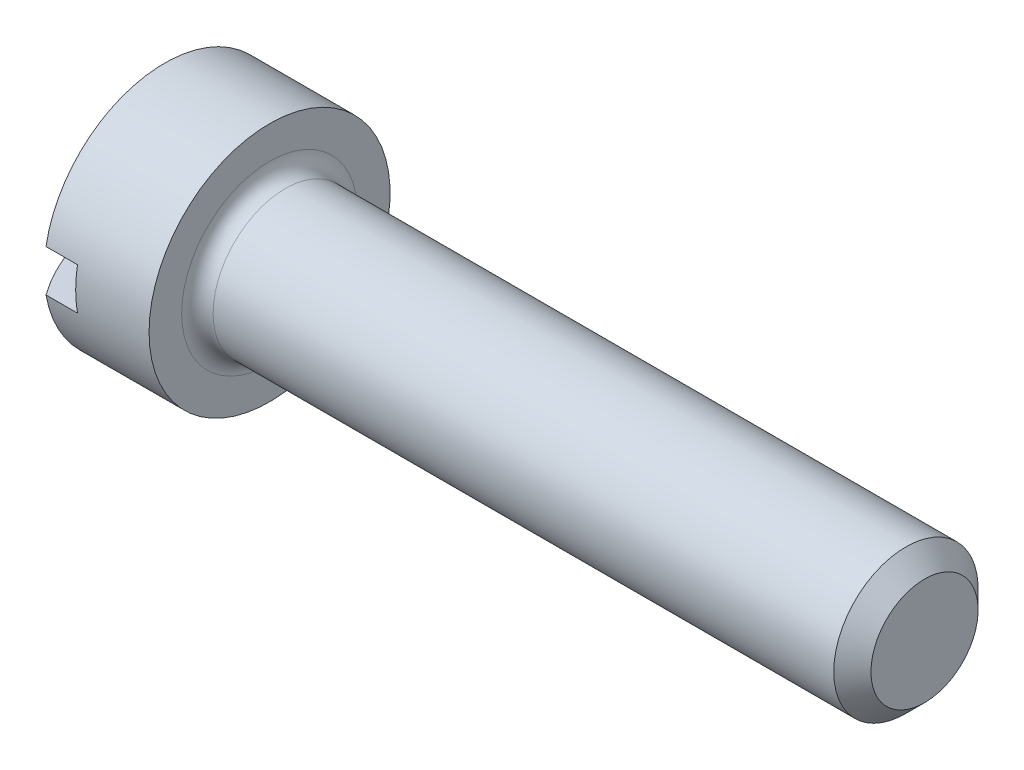
ISO-10303-21;
HEADER;
FILE_DESCRIPTION(('STEP AP214'),'2;1');
FILE_NAME('part.step','',(''),(''),'','','');
FILE_SCHEMA(('AUTOMOTIVE_DESIGN { 1 0 10303 214 1 1 1 1 }'));
ENDSEC;
DATA;
#1=APPLICATION_CONTEXT('core data for automotive mechanical design processes');
#2=APPLICATION_PROTOCOL_DEFINITION('international standard','automotive_design',2000,#1);
#3=PRODUCT_CONTEXT('',#1,'mechanical');
#4=PRODUCT('Part','Part','',(#3));
#5=PRODUCT_RELATED_PRODUCT_CATEGORY('part','',(#4));
#6=PRODUCT_DEFINITION_FORMATION('','',#4);
#7=PRODUCT_DEFINITION_CONTEXT('part definition',#1,'design');
#8=PRODUCT_DEFINITION('design','',#6,#7);
#9=PRODUCT_DEFINITION_SHAPE('','',#8);
#10=(LENGTH_UNIT() NAMED_UNIT(*) SI_UNIT(.MILLI.,.METRE.));
#11=(NAMED_UNIT(*) PLANE_ANGLE_UNIT() SI_UNIT($,.RADIAN.));
#12=(NAMED_UNIT(*) SI_UNIT($,.STERADIAN.) SOLID_ANGLE_UNIT());
#13=UNCERTAINTY_MEASURE_WITH_UNIT(LENGTH_MEASURE(1.E-05),#10,'distance_accuracy_value','');
#14=(GEOMETRIC_REPRESENTATION_CONTEXT(3) GLOBAL_UNCERTAINTY_ASSIGNED_CONTEXT((#13)) GLOBAL_UNIT_ASSIGNED_CONTEXT((#10,
#11,#12)) REPRESENTATION_CONTEXT('',''));
#15=CARTESIAN_POINT('',(0.,0.,0.));
#16=DIRECTION('',(0.,0.,1.));
#17=DIRECTION('',(1.,0.,0.));
#18=AXIS2_PLACEMENT_3D('',#15,#16,#17);
#19=CARTESIAN_POINT('',(-25.4,0.,0.));
#20=DIRECTION('',(-1.,0.,0.));
#21=DIRECTION('',(0.,0.,1.));
#22=AXIS2_PLACEMENT_3D('',#19,#20,#21);
#23=CYLINDRICAL_SURFACE('',#22,1.1684);
#24=CARTESIAN_POINT('',(1.397,0.,0.));
#25=DIRECTION('',(-1.,0.,0.));
#26=DIRECTION('',(0.,0.,1.));
#27=AXIS2_PLACEMENT_3D('',#24,#25,#26);
#28=CIRCLE('',#27,1.1684);
#29=CARTESIAN_POINT('',(1.397,0.,1.1684));
#30=VERTEX_POINT('',#29);
#31=EDGE_CURVE('E110',#30,#30,#28,.T.);
#32=ORIENTED_EDGE('',*,*,#31,.T.);
#33=EDGE_LOOP('',(#32));
#34=FACE_BOUND('',#33,.T.);
#35=CARTESIAN_POINT('',(0.37999556740408,0.,0.));
#36=DIRECTION('',(-1.,0.,0.));
#37=DIRECTION('',(0.,0.,1.));
#38=AXIS2_PLACEMENT_3D('',#35,#36,#37);
#39=CIRCLE('',#38,1.1684);
#40=CARTESIAN_POINT('',(0.37999556740408,-0.2032,-1.15059476793526));
#41=VERTEX_POINT('',#40);
#42=CARTESIAN_POINT('',(0.37999556740408,-0.2032,1.15059476793526));
#43=VERTEX_POINT('',#42);
#44=EDGE_CURVE('E107',#41,#43,#39,.T.);
#45=ORIENTED_EDGE('',*,*,#44,.F.);
#46=DIRECTION('',(-1.,0.,0.));
#47=VECTOR('',#46,1.);
#48=CARTESIAN_POINT('',(-25.4,-0.2032,-1.15059476793526));
#49=LINE('',#48,#47);
#50=CARTESIAN_POINT('',(0.6858,-0.2032,-1.15059476793526));
#51=VERTEX_POINT('',#50);
#52=EDGE_CURVE('E94',#41,#51,#49,.F.);
#53=ORIENTED_EDGE('',*,*,#52,.T.);
#54=CARTESIAN_POINT('',(0.6858,0.,0.));
#55=DIRECTION('',(-1.,0.,0.));
#56=DIRECTION('',(0.,0.,1.));
#57=AXIS2_PLACEMENT_3D('',#54,#55,#56);
#58=CIRCLE('',#57,1.1684);
#59=CARTESIAN_POINT('',(0.6858,0.2032,-1.15059476793526));
#60=VERTEX_POINT('',#59);
#61=EDGE_CURVE('E82',#51,#60,#58,.F.);
#62=ORIENTED_EDGE('',*,*,#61,.T.);
#63=DIRECTION('',(-1.,0.,0.));
#64=VECTOR('',#63,1.);
#65=CARTESIAN_POINT('',(-25.4,0.2032,-1.15059476793526));
#66=LINE('',#65,#64);
#67=CARTESIAN_POINT('',(0.37999556740408,0.2032,-1.15059476793526));
#68=VERTEX_POINT('',#67);
#69=EDGE_CURVE('E86',#60,#68,#66,.T.);
#70=ORIENTED_EDGE('',*,*,#69,.T.);
#71=CARTESIAN_POINT('',(0.37999556740408,0.2032,1.15059476793526));
#72=VERTEX_POINT('',#71);
#73=EDGE_CURVE('E91',#72,#68,#39,.T.);
#74=ORIENTED_EDGE('',*,*,#73,.F.);
#75=DIRECTION('',(-1.,0.,0.));
#76=VECTOR('',#75,1.);
#77=CARTESIAN_POINT('',(-25.4,0.2032,1.15059476793526));
#78=LINE('',#77,#76);
#79=CARTESIAN_POINT('',(0.6858,0.2032,1.15059476793526));
#80=VERTEX_POINT('',#79);
#81=EDGE_CURVE('E47',#72,#80,#78,.F.);
#82=ORIENTED_EDGE('',*,*,#81,.T.);
#83=CARTESIAN_POINT('',(0.6858,-0.2032,1.15059476793526));
#84=VERTEX_POINT('',#83);
#85=EDGE_CURVE('E75',#80,#84,#58,.F.);
#86=ORIENTED_EDGE('',*,*,#85,.T.);
#87=DIRECTION('',(-1.,0.,0.));
#88=VECTOR('',#87,1.);
#89=CARTESIAN_POINT('',(-25.4,-0.2032,1.15059476793526));
#90=LINE('',#89,#88);
#91=EDGE_CURVE('E92',#84,#43,#90,.T.);
#92=ORIENTED_EDGE('',*,*,#91,.T.);
#93=EDGE_LOOP('',(#45,#53,#62,#70,#74,#82,#86,#92));
#94=FACE_BOUND('',#93,.T.);
#95=ADVANCED_FACE('F32',(#34,#94),#23,.T.);
#96=CARTESIAN_POINT('',(1.98628,0.,0.));
#97=DIRECTION('',(-1.,0.,0.));
#98=DIRECTION('',(0.,1.,0.));
#99=AXIS2_PLACEMENT_3D('',#96,#97,#98);
#100=SPHERICAL_SURFACE('',#99,1.98628);
#101=CARTESIAN_POINT('',(1.98628,-0.2032,0.));
#102=DIRECTION('',(0.,1.,0.));
#103=DIRECTION('',(0.,0.,1.));
#104=AXIS2_PLACEMENT_3D('',#101,#102,#103);
#105=CIRCLE('',#104,1.97585880021827);
#106=EDGE_CURVE('E55',#41,#43,#105,.T.);
#107=ORIENTED_EDGE('',*,*,#106,.F.);
#108=ORIENTED_EDGE('',*,*,#44,.T.);
#109=EDGE_LOOP('',(#107,#108));
#110=FACE_BOUND('',#109,.T.);
#111=ADVANCED_FACE('F120',(#110),#100,.T.);
#112=CARTESIAN_POINT('',(1.98628,0.2032,0.));
#113=DIRECTION('',(0.,-1.,0.));
#114=DIRECTION('',(0.,0.,-1.));
#115=AXIS2_PLACEMENT_3D('',#112,#113,#114);
#116=CIRCLE('',#115,1.97585880021827);
#117=EDGE_CURVE('E113',#72,#68,#116,.T.);
#118=ORIENTED_EDGE('',*,*,#117,.F.);
#119=ORIENTED_EDGE('',*,*,#73,.T.);
#120=EDGE_LOOP('',(#118,#119));
#121=FACE_BOUND('',#120,.T.);
#122=ADVANCED_FACE('F122',(#121),#100,.T.);
#123=CARTESIAN_POINT('',(-25.4,0.,0.));
#124=DIRECTION('',(-1.,0.,0.));
#125=DIRECTION('',(0.,0.,1.));
#126=AXIS2_PLACEMENT_3D('',#123,#124,#125);
#127=CYLINDRICAL_SURFACE('',#126,0.69977);
#128=CARTESIAN_POINT('',(1.5494,0.,0.));
#129=DIRECTION('',(-1.,0.,0.));
#130=DIRECTION('',(0.,0.,1.));
#131=AXIS2_PLACEMENT_3D('',#128,#129,#130);
#132=CIRCLE('',#131,0.69977);
#133=CARTESIAN_POINT('',(1.5494,0.,0.69977));
#134=VERTEX_POINT('',#133);
#135=EDGE_CURVE('E11',#134,#134,#132,.F.);
#136=ORIENTED_EDGE('',*,*,#135,.T.);
#137=EDGE_LOOP('',(#136));
#138=FACE_BOUND('',#137,.T.);
#139=CARTESIAN_POINT('',(7.56666,0.,0.));
#140=DIRECTION('',(-1.,0.,0.));
#141=DIRECTION('',(0.,0.,1.));
#142=AXIS2_PLACEMENT_3D('',#139,#140,#141);
#143=CIRCLE('',#142,0.69977);
#144=CARTESIAN_POINT('',(7.56666,0.,0.69977));
#145=VERTEX_POINT('',#144);
#146=EDGE_CURVE('E101',#145,#145,#143,.T.);
#147=ORIENTED_EDGE('',*,*,#146,.T.);
#148=EDGE_LOOP('',(#147));
#149=FACE_BOUND('',#148,.T.);
#150=ADVANCED_FACE('F128',(#138,#149),#127,.T.);
#151=CARTESIAN_POINT('',(1.397,0.69977,0.));
#152=DIRECTION('',(-1.,0.,0.));
#153=DIRECTION('',(0.,0.,1.));
#154=AXIS2_PLACEMENT_3D('',#151,#152,#153);
#155=PLANE('',#154);
#156=CARTESIAN_POINT('',(1.397,0.,0.));
#157=DIRECTION('',(-1.,0.,0.));
#158=DIRECTION('',(0.,0.,1.));
#159=AXIS2_PLACEMENT_3D('',#156,#157,#158);
#160=CIRCLE('',#159,0.85217);
#161=CARTESIAN_POINT('',(1.397,0.,0.85217));
#162=VERTEX_POINT('',#161);
#163=EDGE_CURVE('E40',#162,#162,#160,.T.);
#164=ORIENTED_EDGE('',*,*,#163,.T.);
#165=EDGE_LOOP('',(#164));
#166=FACE_BOUND('',#165,.T.);
#167=ORIENTED_EDGE('',*,*,#31,.F.);
#168=EDGE_LOOP('',(#167));
#169=FACE_BOUND('',#168,.T.);
#170=ADVANCED_FACE('F136',(#166,#169),#155,.F.);
#171=CARTESIAN_POINT('',(7.747,0.51943,0.));
#172=DIRECTION('',(1.,0.,0.));
#173=DIRECTION('',(0.,0.,-1.));
#174=AXIS2_PLACEMENT_3D('',#171,#172,#173);
#175=PLANE('',#174);
#176=CARTESIAN_POINT('',(7.747,0.,0.));
#177=DIRECTION('',(-1.,0.,0.));
#178=DIRECTION('',(0.,0.,1.));
#179=AXIS2_PLACEMENT_3D('',#176,#177,#178);
#180=CIRCLE('',#179,0.51943);
#181=CARTESIAN_POINT('',(7.747,0.,0.51943));
#182=VERTEX_POINT('',#181);
#183=EDGE_CURVE('E104',#182,#182,#180,.T.);
#184=ORIENTED_EDGE('',*,*,#183,.F.);
#185=EDGE_LOOP('',(#184));
#186=FACE_BOUND('',#185,.T.);
#187=ADVANCED_FACE('F133',(#186),#175,.T.);
#188=CARTESIAN_POINT('',(7.56666,0.,0.));
#189=DIRECTION('',(-1.,0.,0.));
#190=DIRECTION('',(0.,0.,1.));
#191=AXIS2_PLACEMENT_3D('',#188,#189,#190);
#192=CONICAL_SURFACE('',#191,0.69977,0.785398163397446);
#193=ORIENTED_EDGE('',*,*,#183,.T.);
#194=EDGE_LOOP('',(#193));
#195=FACE_BOUND('',#194,.T.);
#196=ORIENTED_EDGE('',*,*,#146,.F.);
#197=EDGE_LOOP('',(#196));
#198=FACE_BOUND('',#197,.T.);
#199=ADVANCED_FACE('F146',(#195,#198),#192,.T.);
#200=CARTESIAN_POINT('',(0.,-0.2032,-1.1684));
#201=DIRECTION('',(0.,1.,0.));
#202=DIRECTION('',(0.,0.,1.));
#203=AXIS2_PLACEMENT_3D('',#200,#201,#202);
#204=PLANE('',#203);
#205=ORIENTED_EDGE('',*,*,#106,.T.);
#206=ORIENTED_EDGE('',*,*,#91,.F.);
#207=DIRECTION('',(0.,0.,1.));
#208=VECTOR('',#207,1.);
#209=CARTESIAN_POINT('',(0.6858,-0.2032,-1.1684));
#210=LINE('',#209,#208);
#211=EDGE_CURVE('E80',#51,#84,#210,.T.);
#212=ORIENTED_EDGE('',*,*,#211,.F.);
#213=ORIENTED_EDGE('',*,*,#52,.F.);
#214=EDGE_LOOP('',(#205,#206,#212,#213));
#215=FACE_BOUND('',#214,.T.);
#216=ADVANCED_FACE('F118',(#215),#204,.T.);
#217=CARTESIAN_POINT('',(0.,0.2032,1.1684));
#218=DIRECTION('',(0.,-1.,0.));
#219=DIRECTION('',(0.,0.,-1.));
#220=AXIS2_PLACEMENT_3D('',#217,#218,#219);
#221=PLANE('',#220);
#222=ORIENTED_EDGE('',*,*,#117,.T.);
#223=ORIENTED_EDGE('',*,*,#69,.F.);
#224=DIRECTION('',(0.,0.,-1.));
#225=VECTOR('',#224,1.);
#226=CARTESIAN_POINT('',(0.6858,0.2032,1.1684));
#227=LINE('',#226,#225);
#228=EDGE_CURVE('E77',#80,#60,#227,.T.);
#229=ORIENTED_EDGE('',*,*,#228,.F.);
#230=ORIENTED_EDGE('',*,*,#81,.F.);
#231=EDGE_LOOP('',(#222,#223,#229,#230));
#232=FACE_BOUND('',#231,.T.);
#233=ADVANCED_FACE('F84',(#232),#221,.T.);
#234=CARTESIAN_POINT('',(0.6858,0.2032,-1.1684));
#235=DIRECTION('',(-1.,0.,0.));
#236=DIRECTION('',(0.,0.,1.));
#237=AXIS2_PLACEMENT_3D('',#234,#235,#236);
#238=PLANE('',#237);
#239=ORIENTED_EDGE('',*,*,#211,.T.);
#240=ORIENTED_EDGE('',*,*,#85,.F.);
#241=ORIENTED_EDGE('',*,*,#228,.T.);
#242=ORIENTED_EDGE('',*,*,#61,.F.);
#243=EDGE_LOOP('',(#239,#240,#241,#242));
#244=FACE_BOUND('',#243,.T.);
#245=ADVANCED_FACE('F76',(#244),#238,.T.);
#246=CARTESIAN_POINT('',(1.5494,0.,0.));
#247=DIRECTION('',(-1.,0.,0.));
#248=DIRECTION('',(0.,0.,1.));
#249=AXIS2_PLACEMENT_3D('',#246,#247,#248);
#250=TOROIDAL_SURFACE('',#249,0.85217,0.1524);
#251=ORIENTED_EDGE('',*,*,#135,.F.);
#252=EDGE_LOOP('',(#251));
#253=FACE_BOUND('',#252,.T.);
#254=ORIENTED_EDGE('',*,*,#163,.F.);
#255=EDGE_LOOP('',(#254));
#256=FACE_BOUND('',#255,.T.);
#257=ADVANCED_FACE('F34',(#253,#256),#250,.F.);
#258=CLOSED_SHELL('',(#95,#111,#122,#150,#170,#187,#199,#216,#233,#245,#257));
#259=MANIFOLD_SOLID_BREP('B2',#258);
#260=ADVANCED_BREP_SHAPE_REPRESENTATION('',(#18,#259),#14);
#261=SHAPE_DEFINITION_REPRESENTATION(#9,#260);
ENDSEC;
END-ISO-10303-21;
